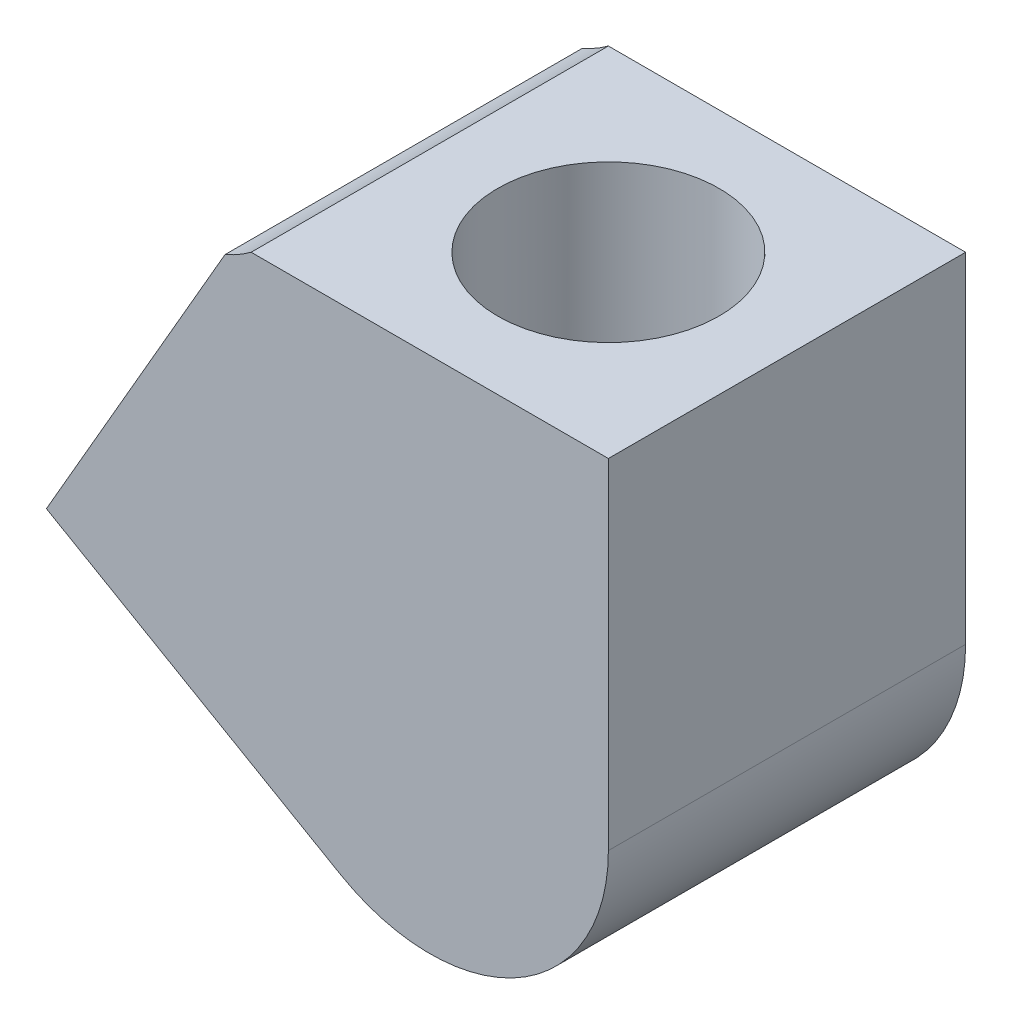
ISO-10303-21;
HEADER;
FILE_DESCRIPTION(('STEP AP214'),'2;1');
FILE_NAME('part.step','',(''),(''),'','','');
FILE_SCHEMA(('AUTOMOTIVE_DESIGN { 1 0 10303 214 1 1 1 1 }'));
ENDSEC;
DATA;
#1=APPLICATION_CONTEXT('core data for automotive mechanical design processes');
#2=APPLICATION_PROTOCOL_DEFINITION('international standard','automotive_design',2000,#1);
#3=PRODUCT_CONTEXT('',#1,'mechanical');
#4=PRODUCT('Part','Part','',(#3));
#5=PRODUCT_RELATED_PRODUCT_CATEGORY('part','',(#4));
#6=PRODUCT_DEFINITION_FORMATION('','',#4);
#7=PRODUCT_DEFINITION_CONTEXT('part definition',#1,'design');
#8=PRODUCT_DEFINITION('design','',#6,#7);
#9=PRODUCT_DEFINITION_SHAPE('','',#8);
#10=(LENGTH_UNIT() NAMED_UNIT(*) SI_UNIT(.MILLI.,.METRE.));
#11=(NAMED_UNIT(*) PLANE_ANGLE_UNIT() SI_UNIT($,.RADIAN.));
#12=(NAMED_UNIT(*) SI_UNIT($,.STERADIAN.) SOLID_ANGLE_UNIT());
#13=UNCERTAINTY_MEASURE_WITH_UNIT(LENGTH_MEASURE(1.E-05),#10,'distance_accuracy_value','');
#14=(GEOMETRIC_REPRESENTATION_CONTEXT(3) GLOBAL_UNCERTAINTY_ASSIGNED_CONTEXT((#13)) GLOBAL_UNIT_ASSIGNED_CONTEXT((#10,
#11,#12)) REPRESENTATION_CONTEXT('',''));
#15=CARTESIAN_POINT('',(0.,0.,0.));
#16=DIRECTION('',(0.,0.,1.));
#17=DIRECTION('',(1.,0.,0.));
#18=AXIS2_PLACEMENT_3D('',#15,#16,#17);
#19=CARTESIAN_POINT('',(0.,0.,0.));
#20=DIRECTION('',(-0.866025403784442,0.499999999999994,0.));
#21=DIRECTION('',(-0.499999999999995,-0.866025403784442,0.));
#22=AXIS2_PLACEMENT_3D('',#19,#20,#21);
#23=PLANE('',#22);
#24=CARTESIAN_POINT('',(0.,0.,0.));
#25=DIRECTION('',(-0.866025403784442,0.499999999999994,0.));
#26=DIRECTION('',(-0.499999999999995,-0.866025403784442,0.));
#27=AXIS2_PLACEMENT_3D('',#24,#25,#26);
#28=CIRCLE('',#27,8.15000000000008);
#29=CARTESIAN_POINT('',(0.,0.,-8.15000000000008));
#30=VERTEX_POINT('',#29);
#31=CARTESIAN_POINT('',(0.,0.,8.15));
#32=VERTEX_POINT('',#31);
#33=EDGE_CURVE('E161',#30,#32,#28,.T.);
#34=ORIENTED_EDGE('',*,*,#33,.T.);
#35=DIRECTION('',(0.,0.,-1.));
#36=VECTOR('',#35,1.);
#37=CARTESIAN_POINT('',(0.,0.,0.));
#38=LINE('',#37,#36);
#39=EDGE_CURVE('E117',#32,#30,#38,.T.);
#40=ORIENTED_EDGE('',*,*,#39,.T.);
#41=EDGE_LOOP('',(#34,#40));
#42=FACE_BOUND('',#41,.T.);
#43=ADVANCED_FACE('F45',(#42),#23,.T.);
#44=CARTESIAN_POINT('',(0.,25.,0.));
#45=DIRECTION('',(0.,-1.,0.));
#46=DIRECTION('',(0.,0.,-1.));
#47=AXIS2_PLACEMENT_3D('',#44,#45,#46);
#48=CYLINDRICAL_SURFACE('',#47,8.15);
#49=CARTESIAN_POINT('',(0.,25.,0.));
#50=DIRECTION('',(0.,1.,0.));
#51=DIRECTION('',(0.,0.,1.));
#52=AXIS2_PLACEMENT_3D('',#49,#50,#51);
#53=CIRCLE('',#52,8.15);
#54=CARTESIAN_POINT('',(0.,25.,8.15));
#55=VERTEX_POINT('',#54);
#56=EDGE_CURVE('E125',#55,#55,#53,.T.);
#57=ORIENTED_EDGE('',*,*,#56,.T.);
#58=EDGE_LOOP('',(#57));
#59=FACE_BOUND('',#58,.T.);
#60=CARTESIAN_POINT('',(0.,0.,0.));
#61=DIRECTION('',(0.,1.,0.));
#62=DIRECTION('',(0.,0.,1.));
#63=AXIS2_PLACEMENT_3D('',#60,#61,#62);
#64=CIRCLE('',#63,8.15);
#65=EDGE_CURVE('E60',#32,#30,#64,.T.);
#66=ORIENTED_EDGE('',*,*,#65,.F.);
#67=CARTESIAN_POINT('',(0.,0.,0.));
#68=DIRECTION('',(-0.866025403784437,-0.500000000000003,0.));
#69=DIRECTION('',(-0.500000000000003,0.866025403784437,0.));
#70=AXIS2_PLACEMENT_3D('',#67,#68,#69);
#71=ELLIPSE('',#70,16.3,8.15000000000004);
#72=EDGE_CURVE('E191',#30,#32,#71,.F.);
#73=ORIENTED_EDGE('',*,*,#72,.F.);
#74=EDGE_LOOP('',(#66,#73));
#75=FACE_BOUND('',#74,.T.);
#76=ADVANCED_FACE('F208',(#59,#75),#48,.F.);
#77=CARTESIAN_POINT('',(0.,25.,13.15));
#78=DIRECTION('',(0.,0.,-1.));
#79=DIRECTION('',(-1.,0.,0.));
#80=AXIS2_PLACEMENT_3D('',#77,#78,#79);
#81=PLANE('',#80);
#82=DIRECTION('',(1.,0.,0.));
#83=VECTOR('',#82,1.);
#84=CARTESIAN_POINT('',(0.,25.,13.15));
#85=LINE('',#84,#83);
#86=CARTESIAN_POINT('',(-13.15,25.,13.15));
#87=VERTEX_POINT('',#86);
#88=CARTESIAN_POINT('',(13.15,25.,13.15));
#89=VERTEX_POINT('',#88);
#90=EDGE_CURVE('E100',#87,#89,#85,.T.);
#91=ORIENTED_EDGE('',*,*,#90,.F.);
#92=CARTESIAN_POINT('',(-19.0818208803223,33.0506832656472,13.15));
#93=DIRECTION('',(0.,0.,-1.));
#94=DIRECTION('',(-1.,0.,0.));
#95=AXIS2_PLACEMENT_3D('',#92,#93,#94);
#96=CIRCLE('',#95,10.);
#97=CARTESIAN_POINT('',(-15.0756350946109,23.8882340597654,13.15));
#98=VERTEX_POINT('',#97);
#99=EDGE_CURVE('E54',#87,#98,#96,.T.);
#100=ORIENTED_EDGE('',*,*,#99,.T.);
#101=DIRECTION('',(0.500000000000004,0.866025403784436,0.));
#102=VECTOR('',#101,1.);
#103=CARTESIAN_POINT('',(-21.6506350946109,12.5000000000001,13.15));
#104=LINE('',#103,#102);
#105=CARTESIAN_POINT('',(-28.225635094611,1.11176594023476,13.15));
#106=VERTEX_POINT('',#105);
#107=EDGE_CURVE('E145',#106,#98,#104,.T.);
#108=ORIENTED_EDGE('',*,*,#107,.F.);
#109=DIRECTION('',(-0.866025403784436,0.500000000000004,0.));
#110=VECTOR('',#109,1.);
#111=CARTESIAN_POINT('',(-6.57500000000005,-11.3882340597653,13.15));
#112=LINE('',#111,#110);
#113=CARTESIAN_POINT('',(-6.57500000000005,-11.3882340597653,13.15));
#114=VERTEX_POINT('',#113);
#115=EDGE_CURVE('E160',#114,#106,#112,.T.);
#116=ORIENTED_EDGE('',*,*,#115,.F.);
#117=CARTESIAN_POINT('',(0.,0.,13.15));
#118=DIRECTION('',(0.,0.,1.));
#119=DIRECTION('',(1.,0.,0.));
#120=AXIS2_PLACEMENT_3D('',#117,#118,#119);
#121=CIRCLE('',#120,13.15);
#122=CARTESIAN_POINT('',(13.15,0.,13.15));
#123=VERTEX_POINT('',#122);
#124=EDGE_CURVE('E81',#114,#123,#121,.T.);
#125=ORIENTED_EDGE('',*,*,#124,.T.);
#126=DIRECTION('',(0.,-1.,0.));
#127=VECTOR('',#126,1.);
#128=CARTESIAN_POINT('',(13.15,25.,13.15));
#129=LINE('',#128,#127);
#130=EDGE_CURVE('E112',#89,#123,#129,.T.);
#131=ORIENTED_EDGE('',*,*,#130,.F.);
#132=EDGE_LOOP('',(#91,#100,#108,#116,#125,#131));
#133=FACE_BOUND('',#132,.T.);
#134=ADVANCED_FACE('F113',(#133),#81,.F.);
#135=CARTESIAN_POINT('',(13.15,25.,0.));
#136=DIRECTION('',(-1.,0.,0.));
#137=DIRECTION('',(0.,0.,1.));
#138=AXIS2_PLACEMENT_3D('',#135,#136,#137);
#139=PLANE('',#138);
#140=DIRECTION('',(0.,0.,-1.));
#141=VECTOR('',#140,1.);
#142=CARTESIAN_POINT('',(13.15,0.,0.));
#143=LINE('',#142,#141);
#144=CARTESIAN_POINT('',(13.15,0.,-13.15));
#145=VERTEX_POINT('',#144);
#146=EDGE_CURVE('E132',#123,#145,#143,.T.);
#147=ORIENTED_EDGE('',*,*,#146,.T.);
#148=DIRECTION('',(0.,-1.,0.));
#149=VECTOR('',#148,1.);
#150=CARTESIAN_POINT('',(13.15,25.,-13.15));
#151=LINE('',#150,#149);
#152=CARTESIAN_POINT('',(13.15,25.,-13.15));
#153=VERTEX_POINT('',#152);
#154=EDGE_CURVE('E118',#153,#145,#151,.T.);
#155=ORIENTED_EDGE('',*,*,#154,.F.);
#156=DIRECTION('',(0.,0.,-1.));
#157=VECTOR('',#156,1.);
#158=CARTESIAN_POINT('',(13.15,25.,0.));
#159=LINE('',#158,#157);
#160=EDGE_CURVE('E104',#89,#153,#159,.T.);
#161=ORIENTED_EDGE('',*,*,#160,.F.);
#162=ORIENTED_EDGE('',*,*,#130,.T.);
#163=EDGE_LOOP('',(#147,#155,#161,#162));
#164=FACE_BOUND('',#163,.T.);
#165=ADVANCED_FACE('F120',(#164),#139,.F.);
#166=CARTESIAN_POINT('',(0.,25.,-13.15));
#167=DIRECTION('',(0.,0.,-1.));
#168=DIRECTION('',(-1.,0.,0.));
#169=AXIS2_PLACEMENT_3D('',#166,#167,#168);
#170=PLANE('',#169);
#171=DIRECTION('',(0.500000000000004,0.866025403784436,0.));
#172=VECTOR('',#171,1.);
#173=CARTESIAN_POINT('',(-21.6506350946109,12.5000000000001,-13.15));
#174=LINE('',#173,#172);
#175=CARTESIAN_POINT('',(-28.225635094611,1.11176594023476,-13.15));
#176=VERTEX_POINT('',#175);
#177=CARTESIAN_POINT('',(-15.0756350946109,23.8882340597654,-13.15));
#178=VERTEX_POINT('',#177);
#179=EDGE_CURVE('E178',#176,#178,#174,.T.);
#180=ORIENTED_EDGE('',*,*,#179,.T.);
#181=CARTESIAN_POINT('',(-19.0818208803223,33.0506832656472,-13.15));
#182=DIRECTION('',(0.,0.,-1.));
#183=DIRECTION('',(-1.,0.,0.));
#184=AXIS2_PLACEMENT_3D('',#181,#182,#183);
#185=CIRCLE('',#184,10.);
#186=CARTESIAN_POINT('',(-13.15,25.,-13.15));
#187=VERTEX_POINT('',#186);
#188=EDGE_CURVE('E11',#178,#187,#185,.F.);
#189=ORIENTED_EDGE('',*,*,#188,.T.);
#190=DIRECTION('',(1.,0.,0.));
#191=VECTOR('',#190,1.);
#192=CARTESIAN_POINT('',(0.,25.,-13.15));
#193=LINE('',#192,#191);
#194=EDGE_CURVE('E122',#187,#153,#193,.T.);
#195=ORIENTED_EDGE('',*,*,#194,.T.);
#196=ORIENTED_EDGE('',*,*,#154,.T.);
#197=CARTESIAN_POINT('',(0.,0.,-13.15));
#198=DIRECTION('',(0.,0.,1.));
#199=DIRECTION('',(1.,0.,0.));
#200=AXIS2_PLACEMENT_3D('',#197,#198,#199);
#201=CIRCLE('',#200,13.15);
#202=CARTESIAN_POINT('',(-6.57500000000005,-11.3882340597653,-13.15));
#203=VERTEX_POINT('',#202);
#204=EDGE_CURVE('E91',#203,#145,#201,.T.);
#205=ORIENTED_EDGE('',*,*,#204,.F.);
#206=DIRECTION('',(-0.866025403784436,0.500000000000004,0.));
#207=VECTOR('',#206,1.);
#208=CARTESIAN_POINT('',(-6.57500000000005,-11.3882340597653,-13.15));
#209=LINE('',#208,#207);
#210=EDGE_CURVE('E175',#203,#176,#209,.T.);
#211=ORIENTED_EDGE('',*,*,#210,.T.);
#212=EDGE_LOOP('',(#180,#189,#195,#196,#205,#211));
#213=FACE_BOUND('',#212,.T.);
#214=ADVANCED_FACE('F221',(#213),#170,.T.);
#215=CARTESIAN_POINT('',(0.,25.,0.));
#216=DIRECTION('',(0.,1.,0.));
#217=DIRECTION('',(0.,0.,1.));
#218=AXIS2_PLACEMENT_3D('',#215,#216,#217);
#219=PLANE('',#218);
#220=DIRECTION('',(0.,0.,-1.));
#221=VECTOR('',#220,1.);
#222=CARTESIAN_POINT('',(-13.15,25.,0.));
#223=LINE('',#222,#221);
#224=EDGE_CURVE('E107',#87,#187,#223,.T.);
#225=ORIENTED_EDGE('',*,*,#224,.F.);
#226=ORIENTED_EDGE('',*,*,#90,.T.);
#227=ORIENTED_EDGE('',*,*,#160,.T.);
#228=ORIENTED_EDGE('',*,*,#194,.F.);
#229=EDGE_LOOP('',(#225,#226,#227,#228));
#230=FACE_BOUND('',#229,.T.);
#231=ORIENTED_EDGE('',*,*,#56,.F.);
#232=EDGE_LOOP('',(#231));
#233=FACE_BOUND('',#232,.T.);
#234=ADVANCED_FACE('F101',(#230,#233),#219,.T.);
#235=CARTESIAN_POINT('',(-6.57500000000005,-11.3882340597653,-13.15));
#236=DIRECTION('',(0.500000000000004,0.866025403784436,0.));
#237=DIRECTION('',(-0.866025403784436,0.500000000000004,0.));
#238=AXIS2_PLACEMENT_3D('',#235,#236,#237);
#239=PLANE('',#238);
#240=DIRECTION('',(0.,0.,1.));
#241=VECTOR('',#240,1.);
#242=CARTESIAN_POINT('',(-6.57500000000005,-11.3882340597653,-13.15));
#243=LINE('',#242,#241);
#244=EDGE_CURVE('E164',#203,#114,#243,.T.);
#245=ORIENTED_EDGE('',*,*,#244,.T.);
#246=ORIENTED_EDGE('',*,*,#115,.T.);
#247=DIRECTION('',(0.,0.,1.));
#248=VECTOR('',#247,1.);
#249=CARTESIAN_POINT('',(-28.225635094611,1.11176594023476,-13.15));
#250=LINE('',#249,#248);
#251=EDGE_CURVE('E158',#176,#106,#250,.T.);
#252=ORIENTED_EDGE('',*,*,#251,.F.);
#253=ORIENTED_EDGE('',*,*,#210,.F.);
#254=EDGE_LOOP('',(#245,#246,#252,#253));
#255=FACE_BOUND('',#254,.T.);
#256=ADVANCED_FACE('F245',(#255),#239,.F.);
#257=CARTESIAN_POINT('',(-21.6506350946109,12.5000000000001,-13.15));
#258=DIRECTION('',(0.866025403784436,-0.500000000000004,0.));
#259=DIRECTION('',(0.500000000000004,0.866025403784436,0.));
#260=AXIS2_PLACEMENT_3D('',#257,#258,#259);
#261=PLANE('',#260);
#262=CARTESIAN_POINT('',(-21.6506350946111,12.4999999999999,0.));
#263=DIRECTION('',(-0.866025403784442,0.499999999999994,0.));
#264=DIRECTION('',(-0.499999999999995,-0.866025403784442,0.));
#265=AXIS2_PLACEMENT_3D('',#262,#263,#264);
#266=CIRCLE('',#265,8.15000000000008);
#267=CARTESIAN_POINT('',(-25.7256350946111,5.4418929591566,0.));
#268=VERTEX_POINT('',#267);
#269=EDGE_CURVE('E187',#268,#268,#266,.T.);
#270=ORIENTED_EDGE('',*,*,#269,.F.);
#271=EDGE_LOOP('',(#270));
#272=FACE_BOUND('',#271,.T.);
#273=ORIENTED_EDGE('',*,*,#251,.T.);
#274=ORIENTED_EDGE('',*,*,#107,.T.);
#275=DIRECTION('',(0.,0.,1.));
#276=VECTOR('',#275,1.);
#277=CARTESIAN_POINT('',(-15.0756350946109,23.8882340597654,-13.15));
#278=LINE('',#277,#276);
#279=EDGE_CURVE('E135',#178,#98,#278,.T.);
#280=ORIENTED_EDGE('',*,*,#279,.F.);
#281=ORIENTED_EDGE('',*,*,#179,.F.);
#282=EDGE_LOOP('',(#273,#274,#280,#281));
#283=FACE_BOUND('',#282,.T.);
#284=ADVANCED_FACE('F155',(#272,#283),#261,.F.);
#285=CARTESIAN_POINT('',(0.,0.,-13.15));
#286=DIRECTION('',(0.,0.,1.));
#287=DIRECTION('',(1.,0.,0.));
#288=AXIS2_PLACEMENT_3D('',#285,#286,#287);
#289=CYLINDRICAL_SURFACE('',#288,13.15);
#290=ORIENTED_EDGE('',*,*,#146,.F.);
#291=ORIENTED_EDGE('',*,*,#124,.F.);
#292=ORIENTED_EDGE('',*,*,#244,.F.);
#293=ORIENTED_EDGE('',*,*,#204,.T.);
#294=EDGE_LOOP('',(#290,#291,#292,#293));
#295=FACE_BOUND('',#294,.T.);
#296=ADVANCED_FACE('F261',(#295),#289,.T.);
#297=CARTESIAN_POINT('',(0.,0.,0.));
#298=DIRECTION('',(-0.866025403784442,0.499999999999994,0.));
#299=DIRECTION('',(-0.499999999999995,-0.866025403784442,0.));
#300=AXIS2_PLACEMENT_3D('',#297,#298,#299);
#301=CYLINDRICAL_SURFACE('',#300,8.15000000000008);
#302=ORIENTED_EDGE('',*,*,#33,.F.);
#303=ORIENTED_EDGE('',*,*,#72,.T.);
#304=EDGE_LOOP('',(#302,#303));
#305=FACE_BOUND('',#304,.T.);
#306=ORIENTED_EDGE('',*,*,#269,.T.);
#307=EDGE_LOOP('',(#306));
#308=FACE_BOUND('',#307,.T.);
#309=ADVANCED_FACE('F202',(#305,#308),#301,.F.);
#310=CARTESIAN_POINT('',(0.,0.,0.));
#311=DIRECTION('',(0.,1.,0.));
#312=DIRECTION('',(0.,0.,1.));
#313=AXIS2_PLACEMENT_3D('',#310,#311,#312);
#314=PLANE('',#313);
#315=ORIENTED_EDGE('',*,*,#65,.T.);
#316=ORIENTED_EDGE('',*,*,#39,.F.);
#317=EDGE_LOOP('',(#315,#316));
#318=FACE_BOUND('',#317,.T.);
#319=ADVANCED_FACE('F207',(#318),#314,.T.);
#320=CARTESIAN_POINT('',(-19.0818208803223,33.0506832656472,-13.15));
#321=DIRECTION('',(0.,0.,-1.));
#322=DIRECTION('',(-1.,0.,0.));
#323=AXIS2_PLACEMENT_3D('',#320,#321,#322);
#324=CYLINDRICAL_SURFACE('',#323,10.);
#325=ORIENTED_EDGE('',*,*,#188,.F.);
#326=ORIENTED_EDGE('',*,*,#279,.T.);
#327=ORIENTED_EDGE('',*,*,#99,.F.);
#328=ORIENTED_EDGE('',*,*,#224,.T.);
#329=EDGE_LOOP('',(#325,#326,#327,#328));
#330=FACE_BOUND('',#329,.T.);
#331=ADVANCED_FACE('F47',(#330),#324,.F.);
#332=CLOSED_SHELL('',(#43,#76,#134,#165,#214,#234,#256,#284,#296,#309,#319,#331));
#333=MANIFOLD_SOLID_BREP('B2',#332);
#334=ADVANCED_BREP_SHAPE_REPRESENTATION('',(#18,#333),#14);
#335=SHAPE_DEFINITION_REPRESENTATION(#9,#334);
ENDSEC;
END-ISO-10303-21;
